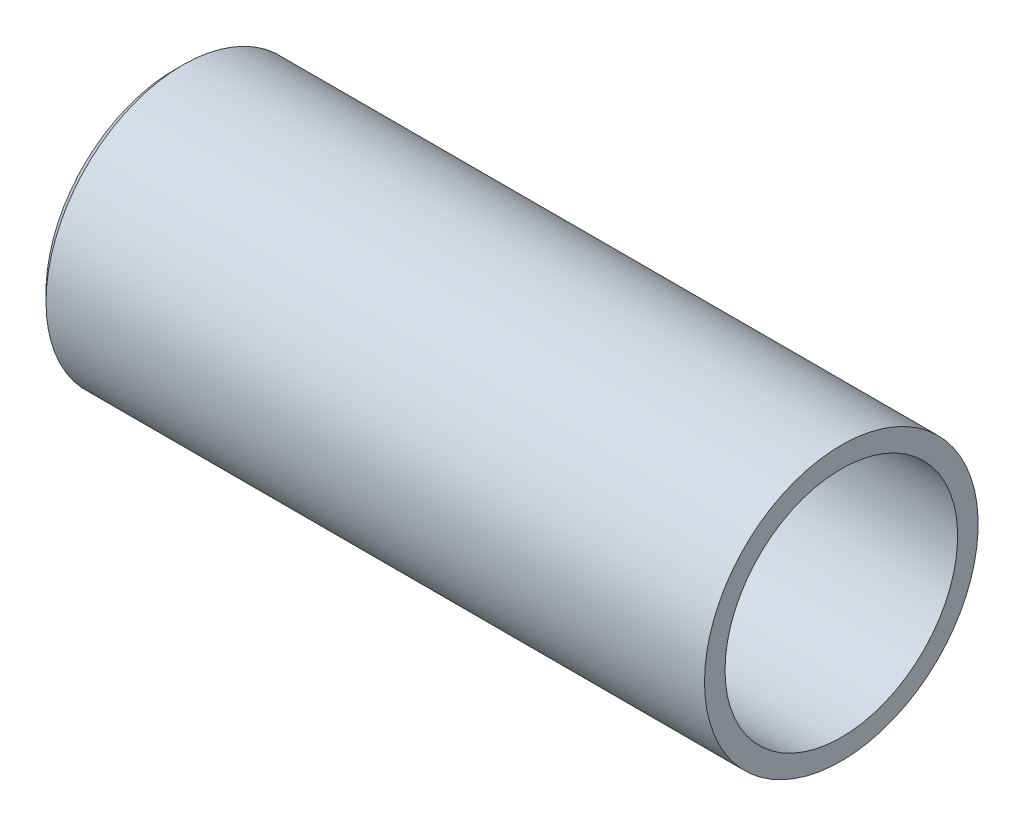
ISO-10303-21;
HEADER;
FILE_DESCRIPTION(('STEP AP214'),'2;1');
FILE_NAME('part.step','',(''),(''),'','','');
FILE_SCHEMA(('AUTOMOTIVE_DESIGN { 1 0 10303 214 1 1 1 1 }'));
ENDSEC;
DATA;
#1=APPLICATION_CONTEXT('core data for automotive mechanical design processes');
#2=APPLICATION_PROTOCOL_DEFINITION('international standard','automotive_design',2000,#1);
#3=PRODUCT_CONTEXT('',#1,'mechanical');
#4=PRODUCT('Part','Part','',(#3));
#5=PRODUCT_RELATED_PRODUCT_CATEGORY('part','',(#4));
#6=PRODUCT_DEFINITION_FORMATION('','',#4);
#7=PRODUCT_DEFINITION_CONTEXT('part definition',#1,'design');
#8=PRODUCT_DEFINITION('design','',#6,#7);
#9=PRODUCT_DEFINITION_SHAPE('','',#8);
#10=(LENGTH_UNIT() NAMED_UNIT(*) SI_UNIT(.MILLI.,.METRE.));
#11=(NAMED_UNIT(*) PLANE_ANGLE_UNIT() SI_UNIT($,.RADIAN.));
#12=(NAMED_UNIT(*) SI_UNIT($,.STERADIAN.) SOLID_ANGLE_UNIT());
#13=UNCERTAINTY_MEASURE_WITH_UNIT(LENGTH_MEASURE(1.E-05),#10,'distance_accuracy_value','');
#14=(GEOMETRIC_REPRESENTATION_CONTEXT(3) GLOBAL_UNCERTAINTY_ASSIGNED_CONTEXT((#13)) GLOBAL_UNIT_ASSIGNED_CONTEXT((#10,
#11,#12)) REPRESENTATION_CONTEXT('',''));
#15=CARTESIAN_POINT('',(0.,0.,0.));
#16=DIRECTION('',(0.,0.,1.));
#17=DIRECTION('',(1.,0.,0.));
#18=AXIS2_PLACEMENT_3D('',#15,#16,#17);
#19=CARTESIAN_POINT('',(1.67237869328167,32.1761435988634,0.));
#20=DIRECTION('',(1.,0.,0.));
#21=DIRECTION('',(0.,0.,-1.));
#22=AXIS2_PLACEMENT_3D('',#19,#20,#21);
#23=PLANE('',#22);
#24=CARTESIAN_POINT('',(1.67237869328167,24.1761435988634,0.));
#25=DIRECTION('',(1.,0.,0.));
#26=DIRECTION('',(0.,0.,-1.));
#27=AXIS2_PLACEMENT_3D('',#24,#25,#26);
#28=CIRCLE('',#27,7.50000000000001);
#29=CARTESIAN_POINT('',(1.67237869328167,24.1761435988634,-7.50000000000001));
#30=VERTEX_POINT('',#29);
#31=EDGE_CURVE('E56',#30,#30,#28,.F.);
#32=ORIENTED_EDGE('',*,*,#31,.T.);
#33=EDGE_LOOP('',(#32));
#34=FACE_BOUND('',#33,.T.);
#35=ADVANCED_FACE('F40',(#34),#23,.F.);
#36=CARTESIAN_POINT('',(40.6723786932817,32.1761435988634,0.));
#37=DIRECTION('',(-1.,0.,0.));
#38=DIRECTION('',(0.,0.,1.));
#39=AXIS2_PLACEMENT_3D('',#36,#37,#38);
#40=PLANE('',#39);
#41=CARTESIAN_POINT('',(40.6723786932817,24.1761435988634,0.));
#42=DIRECTION('',(-1.,0.,0.));
#43=DIRECTION('',(0.,0.,1.));
#44=AXIS2_PLACEMENT_3D('',#41,#42,#43);
#45=CIRCLE('',#44,6.8);
#46=CARTESIAN_POINT('',(40.6723786932817,24.1761435988634,6.8));
#47=VERTEX_POINT('',#46);
#48=EDGE_CURVE('E64',#47,#47,#45,.T.);
#49=ORIENTED_EDGE('',*,*,#48,.T.);
#50=EDGE_LOOP('',(#49));
#51=FACE_BOUND('',#50,.T.);
#52=CARTESIAN_POINT('',(40.6723786932817,24.1761435988634,0.));
#53=DIRECTION('',(-1.,0.,0.));
#54=DIRECTION('',(0.,0.,1.));
#55=AXIS2_PLACEMENT_3D('',#52,#53,#54);
#56=CIRCLE('',#55,8.);
#57=CARTESIAN_POINT('',(40.6723786932817,24.1761435988634,8.));
#58=VERTEX_POINT('',#57);
#59=EDGE_CURVE('E61',#58,#58,#56,.T.);
#60=ORIENTED_EDGE('',*,*,#59,.F.);
#61=EDGE_LOOP('',(#60));
#62=FACE_BOUND('',#61,.T.);
#63=ADVANCED_FACE('F68',(#51,#62),#40,.F.);
#64=CARTESIAN_POINT('',(1.67237869328167,24.1761435988634,0.));
#65=DIRECTION('',(-1.,0.,0.));
#66=DIRECTION('',(0.,0.,1.));
#67=AXIS2_PLACEMENT_3D('',#64,#65,#66);
#68=CYLINDRICAL_SURFACE('',#67,8.);
#69=CARTESIAN_POINT('',(2.17237869328166,24.1761435988634,0.));
#70=DIRECTION('',(1.,0.,0.));
#71=DIRECTION('',(0.,0.,-1.));
#72=AXIS2_PLACEMENT_3D('',#69,#70,#71);
#73=CIRCLE('',#72,8.);
#74=CARTESIAN_POINT('',(2.17237869328166,24.1761435988634,-8.));
#75=VERTEX_POINT('',#74);
#76=EDGE_CURVE('E52',#75,#75,#73,.T.);
#77=ORIENTED_EDGE('',*,*,#76,.T.);
#78=EDGE_LOOP('',(#77));
#79=FACE_BOUND('',#78,.T.);
#80=ORIENTED_EDGE('',*,*,#59,.T.);
#81=EDGE_LOOP('',(#80));
#82=FACE_BOUND('',#81,.T.);
#83=ADVANCED_FACE('F81',(#79,#82),#68,.T.);
#84=CARTESIAN_POINT('',(2.87237869328167,32.1761435988634,0.));
#85=DIRECTION('',(1.,0.,0.));
#86=DIRECTION('',(0.,0.,-1.));
#87=AXIS2_PLACEMENT_3D('',#84,#85,#86);
#88=PLANE('',#87);
#89=CARTESIAN_POINT('',(2.87237869328167,24.1761435988634,0.));
#90=DIRECTION('',(1.,0.,0.));
#91=DIRECTION('',(0.,0.,-1.));
#92=AXIS2_PLACEMENT_3D('',#89,#90,#91);
#93=CIRCLE('',#92,6.3);
#94=CARTESIAN_POINT('',(2.87237869328167,24.1761435988634,-6.3));
#95=VERTEX_POINT('',#94);
#96=EDGE_CURVE('E10',#95,#95,#93,.T.);
#97=ORIENTED_EDGE('',*,*,#96,.T.);
#98=EDGE_LOOP('',(#97));
#99=FACE_BOUND('',#98,.T.);
#100=ADVANCED_FACE('F74',(#99),#88,.T.);
#101=CARTESIAN_POINT('',(1.67237869328167,24.1761435988634,0.));
#102=DIRECTION('',(-1.,0.,0.));
#103=DIRECTION('',(0.,0.,1.));
#104=AXIS2_PLACEMENT_3D('',#101,#102,#103);
#105=CYLINDRICAL_SURFACE('',#104,6.8);
#106=CARTESIAN_POINT('',(3.37237869328168,24.1761435988634,0.));
#107=DIRECTION('',(1.,0.,0.));
#108=DIRECTION('',(0.,0.,-1.));
#109=AXIS2_PLACEMENT_3D('',#106,#107,#108);
#110=CIRCLE('',#109,6.8);
#111=CARTESIAN_POINT('',(3.37237869328168,24.1761435988634,-6.8));
#112=VERTEX_POINT('',#111);
#113=EDGE_CURVE('E48',#112,#112,#110,.F.);
#114=ORIENTED_EDGE('',*,*,#113,.T.);
#115=EDGE_LOOP('',(#114));
#116=FACE_BOUND('',#115,.T.);
#117=ORIENTED_EDGE('',*,*,#48,.F.);
#118=EDGE_LOOP('',(#117));
#119=FACE_BOUND('',#118,.T.);
#120=ADVANCED_FACE('F71',(#116,#119),#105,.F.);
#121=CARTESIAN_POINT('',(1.67237869328167,24.1761435988634,0.));
#122=DIRECTION('',(1.,0.,0.));
#123=DIRECTION('',(0.,0.,-1.));
#124=AXIS2_PLACEMENT_3D('',#121,#122,#123);
#125=CONICAL_SURFACE('',#124,7.50000000000001,0.785398163397448);
#126=ORIENTED_EDGE('',*,*,#76,.F.);
#127=EDGE_LOOP('',(#126));
#128=FACE_BOUND('',#127,.T.);
#129=ORIENTED_EDGE('',*,*,#31,.F.);
#130=EDGE_LOOP('',(#129));
#131=FACE_BOUND('',#130,.T.);
#132=ADVANCED_FACE('F73',(#128,#131),#125,.T.);
#133=CARTESIAN_POINT('',(3.37237869328168,24.1761435988634,0.));
#134=DIRECTION('',(1.,0.,0.));
#135=DIRECTION('',(0.,0.,-1.));
#136=AXIS2_PLACEMENT_3D('',#133,#134,#135);
#137=CONICAL_SURFACE('',#136,6.8,0.785398163397437);
#138=ORIENTED_EDGE('',*,*,#96,.F.);
#139=EDGE_LOOP('',(#138));
#140=FACE_BOUND('',#139,.T.);
#141=ORIENTED_EDGE('',*,*,#113,.F.);
#142=EDGE_LOOP('',(#141));
#143=FACE_BOUND('',#142,.T.);
#144=ADVANCED_FACE('F43',(#140,#143),#137,.F.);
#145=CLOSED_SHELL('',(#35,#63,#83,#100,#120,#132,#144));
#146=MANIFOLD_SOLID_BREP('B2',#145);
#147=ADVANCED_BREP_SHAPE_REPRESENTATION('',(#18,#146),#14);
#148=SHAPE_DEFINITION_REPRESENTATION(#9,#147);
ENDSEC;
END-ISO-10303-21;
